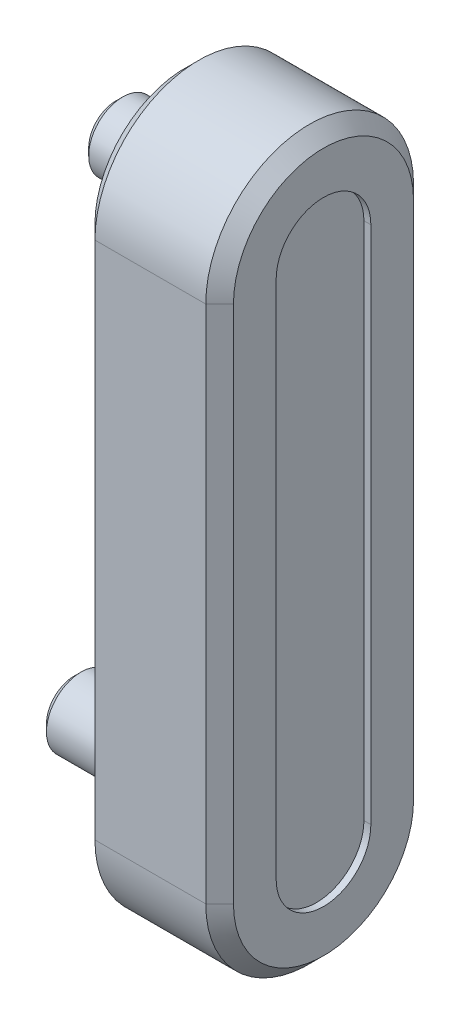
ISO-10303-21;
HEADER;
FILE_DESCRIPTION(('STEP AP214'),'2;1');
FILE_NAME('part.step','',(''),(''),'','','');
FILE_SCHEMA(('AUTOMOTIVE_DESIGN { 1 0 10303 214 1 1 1 1 }'));
ENDSEC;
DATA;
#1=APPLICATION_CONTEXT('core data for automotive mechanical design processes');
#2=APPLICATION_PROTOCOL_DEFINITION('international standard','automotive_design',2000,#1);
#3=PRODUCT_CONTEXT('',#1,'mechanical');
#4=PRODUCT('Part','Part','',(#3));
#5=PRODUCT_RELATED_PRODUCT_CATEGORY('part','',(#4));
#6=PRODUCT_DEFINITION_FORMATION('','',#4);
#7=PRODUCT_DEFINITION_CONTEXT('part definition',#1,'design');
#8=PRODUCT_DEFINITION('design','',#6,#7);
#9=PRODUCT_DEFINITION_SHAPE('','',#8);
#10=(LENGTH_UNIT() NAMED_UNIT(*) SI_UNIT(.MILLI.,.METRE.));
#11=(NAMED_UNIT(*) PLANE_ANGLE_UNIT() SI_UNIT($,.RADIAN.));
#12=(NAMED_UNIT(*) SI_UNIT($,.STERADIAN.) SOLID_ANGLE_UNIT());
#13=UNCERTAINTY_MEASURE_WITH_UNIT(LENGTH_MEASURE(1.E-05),#10,'distance_accuracy_value','');
#14=(GEOMETRIC_REPRESENTATION_CONTEXT(3) GLOBAL_UNCERTAINTY_ASSIGNED_CONTEXT((#13)) GLOBAL_UNIT_ASSIGNED_CONTEXT((#10,
#11,#12)) REPRESENTATION_CONTEXT('',''));
#15=CARTESIAN_POINT('',(0.,0.,0.));
#16=DIRECTION('',(0.,0.,1.));
#17=DIRECTION('',(1.,0.,0.));
#18=AXIS2_PLACEMENT_3D('',#15,#16,#17);
#19=CARTESIAN_POINT('',(10.,0.,0.));
#20=DIRECTION('',(-1.,0.,0.));
#21=DIRECTION('',(0.,0.,1.));
#22=AXIS2_PLACEMENT_3D('',#19,#20,#21);
#23=CYLINDRICAL_SURFACE('',#22,4.9);
#24=CARTESIAN_POINT('',(1.00000000000001,0.,0.));
#25=DIRECTION('',(1.,0.,0.));
#26=DIRECTION('',(0.,0.,-1.));
#27=AXIS2_PLACEMENT_3D('',#24,#25,#26);
#28=CIRCLE('',#27,4.9);
#29=CARTESIAN_POINT('',(1.00000000000001,0.,-4.9));
#30=VERTEX_POINT('',#29);
#31=EDGE_CURVE('E251',#30,#30,#28,.T.);
#32=ORIENTED_EDGE('',*,*,#31,.T.);
#33=EDGE_LOOP('',(#32));
#34=FACE_BOUND('',#33,.T.);
#35=CARTESIAN_POINT('',(10.,0.,0.));
#36=DIRECTION('',(1.,0.,0.));
#37=DIRECTION('',(0.,0.,-1.));
#38=AXIS2_PLACEMENT_3D('',#35,#36,#37);
#39=CIRCLE('',#38,4.9);
#40=CARTESIAN_POINT('',(10.,0.,-4.9));
#41=VERTEX_POINT('',#40);
#42=EDGE_CURVE('E187',#41,#41,#39,.T.);
#43=ORIENTED_EDGE('',*,*,#42,.F.);
#44=EDGE_LOOP('',(#43));
#45=FACE_BOUND('',#44,.T.);
#46=ADVANCED_FACE('F42',(#34,#45),#23,.T.);
#47=CARTESIAN_POINT('',(0.,0.,0.));
#48=DIRECTION('',(1.,0.,0.));
#49=DIRECTION('',(0.,0.,-1.));
#50=AXIS2_PLACEMENT_3D('',#47,#48,#49);
#51=PLANE('',#50);
#52=CARTESIAN_POINT('',(0.,0.,0.));
#53=DIRECTION('',(1.,0.,0.));
#54=DIRECTION('',(0.,0.,-1.));
#55=AXIS2_PLACEMENT_3D('',#52,#53,#54);
#56=CIRCLE('',#55,3.9);
#57=CARTESIAN_POINT('',(0.,0.,-3.9));
#58=VERTEX_POINT('',#57);
#59=EDGE_CURVE('E254',#58,#58,#56,.F.);
#60=ORIENTED_EDGE('',*,*,#59,.T.);
#61=EDGE_LOOP('',(#60));
#62=FACE_BOUND('',#61,.T.);
#63=ADVANCED_FACE('F271',(#62),#51,.F.);
#64=CARTESIAN_POINT('',(30.,0.,15.));
#65=DIRECTION('',(0.,0.,-1.));
#66=DIRECTION('',(0.,1.,0.));
#67=AXIS2_PLACEMENT_3D('',#64,#65,#66);
#68=PLANE('',#67);
#69=DIRECTION('',(-1.,0.,0.));
#70=VECTOR('',#69,1.);
#71=CARTESIAN_POINT('',(30.,0.,15.));
#72=LINE('',#71,#70);
#73=CARTESIAN_POINT('',(28.,0.,15.));
#74=VERTEX_POINT('',#73);
#75=CARTESIAN_POINT('',(12.,0.,15.));
#76=VERTEX_POINT('',#75);
#77=EDGE_CURVE('E174',#74,#76,#72,.T.);
#78=ORIENTED_EDGE('',*,*,#77,.T.);
#79=DIRECTION('',(0.,-1.,0.));
#80=VECTOR('',#79,1.);
#81=CARTESIAN_POINT('',(12.,0.,15.));
#82=LINE('',#81,#80);
#83=CARTESIAN_POINT('',(12.,-75.,15.));
#84=VERTEX_POINT('',#83);
#85=EDGE_CURVE('E215',#76,#84,#82,.T.);
#86=ORIENTED_EDGE('',*,*,#85,.T.);
#87=DIRECTION('',(-1.,0.,0.));
#88=VECTOR('',#87,1.);
#89=CARTESIAN_POINT('',(30.,-75.,15.));
#90=LINE('',#89,#88);
#91=CARTESIAN_POINT('',(28.,-75.,15.));
#92=VERTEX_POINT('',#91);
#93=EDGE_CURVE('E184',#92,#84,#90,.T.);
#94=ORIENTED_EDGE('',*,*,#93,.F.);
#95=DIRECTION('',(0.,1.,0.));
#96=VECTOR('',#95,1.);
#97=CARTESIAN_POINT('',(28.,0.,15.));
#98=LINE('',#97,#96);
#99=EDGE_CURVE('E213',#92,#74,#98,.T.);
#100=ORIENTED_EDGE('',*,*,#99,.T.);
#101=EDGE_LOOP('',(#78,#86,#94,#100));
#102=FACE_BOUND('',#101,.T.);
#103=ADVANCED_FACE('F278',(#102),#68,.F.);
#104=CARTESIAN_POINT('',(30.,-75.,0.));
#105=DIRECTION('',(-1.,0.,0.));
#106=DIRECTION('',(0.,0.,1.));
#107=AXIS2_PLACEMENT_3D('',#104,#105,#106);
#108=CYLINDRICAL_SURFACE('',#107,15.);
#109=ORIENTED_EDGE('',*,*,#93,.T.);
#110=CARTESIAN_POINT('',(12.,-75.,0.));
#111=DIRECTION('',(1.,0.,0.));
#112=DIRECTION('',(0.,0.,-1.));
#113=AXIS2_PLACEMENT_3D('',#110,#111,#112);
#114=CIRCLE('',#113,15.);
#115=CARTESIAN_POINT('',(12.,-75.,-15.));
#116=VERTEX_POINT('',#115);
#117=EDGE_CURVE('E211',#84,#116,#114,.T.);
#118=ORIENTED_EDGE('',*,*,#117,.T.);
#119=DIRECTION('',(-1.,0.,0.));
#120=VECTOR('',#119,1.);
#121=CARTESIAN_POINT('',(30.,-75.,-15.));
#122=LINE('',#121,#120);
#123=CARTESIAN_POINT('',(28.,-75.,-15.));
#124=VERTEX_POINT('',#123);
#125=EDGE_CURVE('E181',#124,#116,#122,.T.);
#126=ORIENTED_EDGE('',*,*,#125,.F.);
#127=CARTESIAN_POINT('',(28.,-75.,0.));
#128=DIRECTION('',(1.,0.,0.));
#129=DIRECTION('',(0.,0.,-1.));
#130=AXIS2_PLACEMENT_3D('',#127,#128,#129);
#131=CIRCLE('',#130,15.);
#132=EDGE_CURVE('E209',#124,#92,#131,.F.);
#133=ORIENTED_EDGE('',*,*,#132,.T.);
#134=EDGE_LOOP('',(#109,#118,#126,#133));
#135=FACE_BOUND('',#134,.T.);
#136=ADVANCED_FACE('F400',(#135),#108,.T.);
#137=CARTESIAN_POINT('',(30.,0.,-15.));
#138=DIRECTION('',(0.,0.,-1.));
#139=DIRECTION('',(0.,1.,0.));
#140=AXIS2_PLACEMENT_3D('',#137,#138,#139);
#141=PLANE('',#140);
#142=ORIENTED_EDGE('',*,*,#125,.T.);
#143=DIRECTION('',(0.,1.,0.));
#144=VECTOR('',#143,1.);
#145=CARTESIAN_POINT('',(12.,0.,-15.));
#146=LINE('',#145,#144);
#147=CARTESIAN_POINT('',(12.,0.,-15.));
#148=VERTEX_POINT('',#147);
#149=EDGE_CURVE('E202',#116,#148,#146,.T.);
#150=ORIENTED_EDGE('',*,*,#149,.T.);
#151=DIRECTION('',(-1.,0.,0.));
#152=VECTOR('',#151,1.);
#153=CARTESIAN_POINT('',(30.,0.,-15.));
#154=LINE('',#153,#152);
#155=CARTESIAN_POINT('',(28.,0.,-15.));
#156=VERTEX_POINT('',#155);
#157=EDGE_CURVE('E177',#156,#148,#154,.T.);
#158=ORIENTED_EDGE('',*,*,#157,.F.);
#159=DIRECTION('',(0.,-1.,0.));
#160=VECTOR('',#159,1.);
#161=CARTESIAN_POINT('',(28.,0.,-15.));
#162=LINE('',#161,#160);
#163=EDGE_CURVE('E199',#156,#124,#162,.T.);
#164=ORIENTED_EDGE('',*,*,#163,.T.);
#165=EDGE_LOOP('',(#142,#150,#158,#164));
#166=FACE_BOUND('',#165,.T.);
#167=ADVANCED_FACE('F396',(#166),#141,.T.);
#168=CARTESIAN_POINT('',(30.,0.,0.));
#169=DIRECTION('',(-1.,0.,0.));
#170=DIRECTION('',(0.,0.,1.));
#171=AXIS2_PLACEMENT_3D('',#168,#169,#170);
#172=CYLINDRICAL_SURFACE('',#171,15.);
#173=ORIENTED_EDGE('',*,*,#157,.T.);
#174=CARTESIAN_POINT('',(12.,0.,0.));
#175=DIRECTION('',(1.,0.,0.));
#176=DIRECTION('',(0.,0.,-1.));
#177=AXIS2_PLACEMENT_3D('',#174,#175,#176);
#178=CIRCLE('',#177,15.);
#179=EDGE_CURVE('E207',#148,#76,#178,.T.);
#180=ORIENTED_EDGE('',*,*,#179,.T.);
#181=ORIENTED_EDGE('',*,*,#77,.F.);
#182=CARTESIAN_POINT('',(28.,0.,0.));
#183=DIRECTION('',(1.,0.,0.));
#184=DIRECTION('',(0.,0.,-1.));
#185=AXIS2_PLACEMENT_3D('',#182,#183,#184);
#186=CIRCLE('',#185,15.);
#187=EDGE_CURVE('E205',#74,#156,#186,.F.);
#188=ORIENTED_EDGE('',*,*,#187,.T.);
#189=EDGE_LOOP('',(#173,#180,#181,#188));
#190=FACE_BOUND('',#189,.T.);
#191=ADVANCED_FACE('F389',(#190),#172,.T.);
#192=CARTESIAN_POINT('',(30.,0.,0.));
#193=DIRECTION('',(1.,0.,0.));
#194=DIRECTION('',(0.,0.,-1.));
#195=AXIS2_PLACEMENT_3D('',#192,#193,#194);
#196=PLANE('',#195);
#197=CARTESIAN_POINT('',(30.,0.,0.));
#198=DIRECTION('',(1.,0.,0.));
#199=DIRECTION('',(0.,0.,-1.));
#200=AXIS2_PLACEMENT_3D('',#197,#198,#199);
#201=CIRCLE('',#200,6.83563427501715);
#202=CARTESIAN_POINT('',(30.,0.,-6.83563427501715));
#203=VERTEX_POINT('',#202);
#204=CARTESIAN_POINT('',(30.,0.,6.83563427501715));
#205=VERTEX_POINT('',#204);
#206=EDGE_CURVE('E58',#203,#205,#201,.T.);
#207=ORIENTED_EDGE('',*,*,#206,.F.);
#208=DIRECTION('',(0.,1.,0.));
#209=VECTOR('',#208,1.);
#210=CARTESIAN_POINT('',(30.,0.,-6.83563427501715));
#211=LINE('',#210,#209);
#212=CARTESIAN_POINT('',(30.,-75.,-6.83563427501715));
#213=VERTEX_POINT('',#212);
#214=EDGE_CURVE('E154',#213,#203,#211,.T.);
#215=ORIENTED_EDGE('',*,*,#214,.F.);
#216=CARTESIAN_POINT('',(30.,-75.,0.));
#217=DIRECTION('',(1.,0.,0.));
#218=DIRECTION('',(0.,0.,-1.));
#219=AXIS2_PLACEMENT_3D('',#216,#217,#218);
#220=CIRCLE('',#219,6.83563427501715);
#221=CARTESIAN_POINT('',(30.,-75.,6.83563427501714));
#222=VERTEX_POINT('',#221);
#223=EDGE_CURVE('E157',#222,#213,#220,.T.);
#224=ORIENTED_EDGE('',*,*,#223,.F.);
#225=DIRECTION('',(0.,-1.,0.));
#226=VECTOR('',#225,1.);
#227=CARTESIAN_POINT('',(30.,0.,6.83563427501715));
#228=LINE('',#227,#226);
#229=EDGE_CURVE('E163',#205,#222,#228,.T.);
#230=ORIENTED_EDGE('',*,*,#229,.F.);
#231=EDGE_LOOP('',(#207,#215,#224,#230));
#232=FACE_BOUND('',#231,.T.);
#233=CARTESIAN_POINT('',(30.,-75.,0.));
#234=DIRECTION('',(1.,0.,0.));
#235=DIRECTION('',(0.,0.,-1.));
#236=AXIS2_PLACEMENT_3D('',#233,#234,#235);
#237=CIRCLE('',#236,13.);
#238=CARTESIAN_POINT('',(30.,-75.,13.));
#239=VERTEX_POINT('',#238);
#240=CARTESIAN_POINT('',(30.,-75.,-13.));
#241=VERTEX_POINT('',#240);
#242=EDGE_CURVE('E219',#239,#241,#237,.T.);
#243=ORIENTED_EDGE('',*,*,#242,.T.);
#244=DIRECTION('',(0.,1.,0.));
#245=VECTOR('',#244,1.);
#246=CARTESIAN_POINT('',(30.,0.,-13.));
#247=LINE('',#246,#245);
#248=CARTESIAN_POINT('',(30.,0.,-13.));
#249=VERTEX_POINT('',#248);
#250=EDGE_CURVE('E223',#241,#249,#247,.T.);
#251=ORIENTED_EDGE('',*,*,#250,.T.);
#252=CARTESIAN_POINT('',(30.,0.,0.));
#253=DIRECTION('',(1.,0.,0.));
#254=DIRECTION('',(0.,0.,-1.));
#255=AXIS2_PLACEMENT_3D('',#252,#253,#254);
#256=CIRCLE('',#255,13.);
#257=CARTESIAN_POINT('',(30.,0.,13.));
#258=VERTEX_POINT('',#257);
#259=EDGE_CURVE('E221',#249,#258,#256,.T.);
#260=ORIENTED_EDGE('',*,*,#259,.T.);
#261=DIRECTION('',(0.,-1.,0.));
#262=VECTOR('',#261,1.);
#263=CARTESIAN_POINT('',(30.,-75.,13.));
#264=LINE('',#263,#262);
#265=EDGE_CURVE('E217',#258,#239,#264,.T.);
#266=ORIENTED_EDGE('',*,*,#265,.T.);
#267=EDGE_LOOP('',(#243,#251,#260,#266));
#268=FACE_BOUND('',#267,.T.);
#269=ADVANCED_FACE('F386',(#232,#268),#196,.T.);
#270=CARTESIAN_POINT('',(10.,0.,0.));
#271=DIRECTION('',(1.,0.,0.));
#272=DIRECTION('',(0.,0.,-1.));
#273=AXIS2_PLACEMENT_3D('',#270,#271,#272);
#274=PLANE('',#273);
#275=CARTESIAN_POINT('',(10.,-75.,0.));
#276=DIRECTION('',(1.,0.,0.));
#277=DIRECTION('',(0.,0.,-1.));
#278=AXIS2_PLACEMENT_3D('',#275,#276,#277);
#279=CIRCLE('',#278,10.);
#280=CARTESIAN_POINT('',(10.,-75.,-10.));
#281=VERTEX_POINT('',#280);
#282=EDGE_CURVE('E226',#281,#281,#279,.F.);
#283=ORIENTED_EDGE('',*,*,#282,.F.);
#284=EDGE_LOOP('',(#283));
#285=FACE_BOUND('',#284,.T.);
#286=CARTESIAN_POINT('',(10.,0.,0.));
#287=DIRECTION('',(1.,0.,0.));
#288=DIRECTION('',(0.,0.,-1.));
#289=AXIS2_PLACEMENT_3D('',#286,#287,#288);
#290=CIRCLE('',#289,13.);
#291=CARTESIAN_POINT('',(10.,0.,13.));
#292=VERTEX_POINT('',#291);
#293=CARTESIAN_POINT('',(10.,0.,-13.));
#294=VERTEX_POINT('',#293);
#295=EDGE_CURVE('E194',#292,#294,#290,.F.);
#296=ORIENTED_EDGE('',*,*,#295,.T.);
#297=DIRECTION('',(0.,-1.,0.));
#298=VECTOR('',#297,1.);
#299=CARTESIAN_POINT('',(10.,-75.,-13.));
#300=LINE('',#299,#298);
#301=CARTESIAN_POINT('',(10.,-75.,-13.));
#302=VERTEX_POINT('',#301);
#303=EDGE_CURVE('E196',#294,#302,#300,.T.);
#304=ORIENTED_EDGE('',*,*,#303,.T.);
#305=CARTESIAN_POINT('',(10.,-75.,0.));
#306=DIRECTION('',(1.,0.,0.));
#307=DIRECTION('',(0.,0.,-1.));
#308=AXIS2_PLACEMENT_3D('',#305,#306,#307);
#309=CIRCLE('',#308,13.);
#310=CARTESIAN_POINT('',(10.,-75.,13.));
#311=VERTEX_POINT('',#310);
#312=EDGE_CURVE('E192',#302,#311,#309,.F.);
#313=ORIENTED_EDGE('',*,*,#312,.T.);
#314=DIRECTION('',(0.,1.,0.));
#315=VECTOR('',#314,1.);
#316=CARTESIAN_POINT('',(10.,0.,13.));
#317=LINE('',#316,#315);
#318=EDGE_CURVE('E190',#311,#292,#317,.T.);
#319=ORIENTED_EDGE('',*,*,#318,.T.);
#320=EDGE_LOOP('',(#296,#304,#313,#319));
#321=FACE_BOUND('',#320,.T.);
#322=ORIENTED_EDGE('',*,*,#42,.T.);
#323=EDGE_LOOP('',(#322));
#324=FACE_BOUND('',#323,.T.);
#325=ADVANCED_FACE('F313',(#285,#321,#324),#274,.F.);
#326=CARTESIAN_POINT('',(12.,0.,15.));
#327=DIRECTION('',(0.70710678118655,0.,-0.707106781186545));
#328=DIRECTION('',(0.,-1.,0.));
#329=AXIS2_PLACEMENT_3D('',#326,#327,#328);
#330=PLANE('',#329);
#331=DIRECTION('',(-0.707106781186545,0.,-0.70710678118655));
#332=VECTOR('',#331,1.);
#333=CARTESIAN_POINT('',(12.,-75.,15.));
#334=LINE('',#333,#332);
#335=EDGE_CURVE('E232',#84,#311,#334,.T.);
#336=ORIENTED_EDGE('',*,*,#335,.F.);
#337=ORIENTED_EDGE('',*,*,#85,.F.);
#338=DIRECTION('',(0.707106781186545,0.,0.70710678118655));
#339=VECTOR('',#338,1.);
#340=CARTESIAN_POINT('',(10.,0.,13.));
#341=LINE('',#340,#339);
#342=EDGE_CURVE('E178',#292,#76,#341,.T.);
#343=ORIENTED_EDGE('',*,*,#342,.F.);
#344=ORIENTED_EDGE('',*,*,#318,.F.);
#345=EDGE_LOOP('',(#336,#337,#343,#344));
#346=FACE_BOUND('',#345,.T.);
#347=ADVANCED_FACE('F307',(#346),#330,.F.);
#348=CARTESIAN_POINT('',(12.,0.,0.));
#349=DIRECTION('',(1.,0.,0.));
#350=DIRECTION('',(0.,0.,-1.));
#351=AXIS2_PLACEMENT_3D('',#348,#349,#350);
#352=CONICAL_SURFACE('',#351,15.,0.785398163397452);
#353=ORIENTED_EDGE('',*,*,#342,.T.);
#354=ORIENTED_EDGE('',*,*,#179,.F.);
#355=DIRECTION('',(0.707106781186545,0.,-0.70710678118655));
#356=VECTOR('',#355,1.);
#357=CARTESIAN_POINT('',(10.,0.,-13.));
#358=LINE('',#357,#356);
#359=EDGE_CURVE('E229',#294,#148,#358,.T.);
#360=ORIENTED_EDGE('',*,*,#359,.F.);
#361=ORIENTED_EDGE('',*,*,#295,.F.);
#362=EDGE_LOOP('',(#353,#354,#360,#361));
#363=FACE_BOUND('',#362,.T.);
#364=ADVANCED_FACE('F300',(#363),#352,.T.);
#365=CARTESIAN_POINT('',(12.,-75.,0.));
#366=DIRECTION('',(1.,0.,0.));
#367=DIRECTION('',(0.,0.,-1.));
#368=AXIS2_PLACEMENT_3D('',#365,#366,#367);
#369=CONICAL_SURFACE('',#368,15.,0.785398163397452);
#370=ORIENTED_EDGE('',*,*,#335,.T.);
#371=ORIENTED_EDGE('',*,*,#312,.F.);
#372=DIRECTION('',(-0.707106781186545,0.,0.70710678118655));
#373=VECTOR('',#372,1.);
#374=CARTESIAN_POINT('',(12.,-75.,-15.));
#375=LINE('',#374,#373);
#376=EDGE_CURVE('E227',#116,#302,#375,.T.);
#377=ORIENTED_EDGE('',*,*,#376,.F.);
#378=ORIENTED_EDGE('',*,*,#117,.F.);
#379=EDGE_LOOP('',(#370,#371,#377,#378));
#380=FACE_BOUND('',#379,.T.);
#381=ADVANCED_FACE('F293',(#380),#369,.T.);
#382=CARTESIAN_POINT('',(10.,0.,-13.));
#383=DIRECTION('',(-0.70710678118655,0.,-0.707106781186545));
#384=DIRECTION('',(0.,1.,0.));
#385=AXIS2_PLACEMENT_3D('',#382,#383,#384);
#386=PLANE('',#385);
#387=ORIENTED_EDGE('',*,*,#359,.T.);
#388=ORIENTED_EDGE('',*,*,#149,.F.);
#389=ORIENTED_EDGE('',*,*,#376,.T.);
#390=ORIENTED_EDGE('',*,*,#303,.F.);
#391=EDGE_LOOP('',(#387,#388,#389,#390));
#392=FACE_BOUND('',#391,.T.);
#393=ADVANCED_FACE('F285',(#392),#386,.T.);
#394=CARTESIAN_POINT('',(30.,0.,13.));
#395=DIRECTION('',(0.707106781186545,0.,0.70710678118655));
#396=DIRECTION('',(0.,1.,0.));
#397=AXIS2_PLACEMENT_3D('',#394,#395,#396);
#398=PLANE('',#397);
#399=DIRECTION('',(-0.70710678118655,0.,0.707106781186545));
#400=VECTOR('',#399,1.);
#401=CARTESIAN_POINT('',(30.,-75.,13.));
#402=LINE('',#401,#400);
#403=EDGE_CURVE('E239',#239,#92,#402,.T.);
#404=ORIENTED_EDGE('',*,*,#403,.F.);
#405=ORIENTED_EDGE('',*,*,#265,.F.);
#406=DIRECTION('',(0.70710678118655,0.,-0.707106781186545));
#407=VECTOR('',#406,1.);
#408=CARTESIAN_POINT('',(28.,0.,15.));
#409=LINE('',#408,#407);
#410=EDGE_CURVE('E230',#74,#258,#409,.T.);
#411=ORIENTED_EDGE('',*,*,#410,.F.);
#412=ORIENTED_EDGE('',*,*,#99,.F.);
#413=EDGE_LOOP('',(#404,#405,#411,#412));
#414=FACE_BOUND('',#413,.T.);
#415=ADVANCED_FACE('F292',(#414),#398,.T.);
#416=CARTESIAN_POINT('',(30.,0.,0.));
#417=DIRECTION('',(-1.,0.,0.));
#418=DIRECTION('',(0.,0.,1.));
#419=AXIS2_PLACEMENT_3D('',#416,#417,#418);
#420=CONICAL_SURFACE('',#419,13.,0.785398163397445);
#421=ORIENTED_EDGE('',*,*,#410,.T.);
#422=ORIENTED_EDGE('',*,*,#259,.F.);
#423=DIRECTION('',(0.70710678118655,0.,0.707106781186545));
#424=VECTOR('',#423,1.);
#425=CARTESIAN_POINT('',(28.,0.,-15.));
#426=LINE('',#425,#424);
#427=EDGE_CURVE('E66',#156,#249,#426,.T.);
#428=ORIENTED_EDGE('',*,*,#427,.F.);
#429=ORIENTED_EDGE('',*,*,#187,.F.);
#430=EDGE_LOOP('',(#421,#422,#428,#429));
#431=FACE_BOUND('',#430,.T.);
#432=ADVANCED_FACE('F329',(#431),#420,.T.);
#433=CARTESIAN_POINT('',(30.,-75.,0.));
#434=DIRECTION('',(-1.,0.,0.));
#435=DIRECTION('',(0.,0.,1.));
#436=AXIS2_PLACEMENT_3D('',#433,#434,#435);
#437=CONICAL_SURFACE('',#436,13.,0.785398163397445);
#438=ORIENTED_EDGE('',*,*,#403,.T.);
#439=ORIENTED_EDGE('',*,*,#132,.F.);
#440=DIRECTION('',(-0.70710678118655,0.,-0.707106781186545));
#441=VECTOR('',#440,1.);
#442=CARTESIAN_POINT('',(30.,-75.,-13.));
#443=LINE('',#442,#441);
#444=EDGE_CURVE('E170',#241,#124,#443,.T.);
#445=ORIENTED_EDGE('',*,*,#444,.F.);
#446=ORIENTED_EDGE('',*,*,#242,.F.);
#447=EDGE_LOOP('',(#438,#439,#445,#446));
#448=FACE_BOUND('',#447,.T.);
#449=ADVANCED_FACE('F323',(#448),#437,.T.);
#450=CARTESIAN_POINT('',(28.,0.,-15.));
#451=DIRECTION('',(-0.707106781186545,0.,0.70710678118655));
#452=DIRECTION('',(0.,-1.,0.));
#453=AXIS2_PLACEMENT_3D('',#450,#451,#452);
#454=PLANE('',#453);
#455=ORIENTED_EDGE('',*,*,#427,.T.);
#456=ORIENTED_EDGE('',*,*,#250,.F.);
#457=ORIENTED_EDGE('',*,*,#444,.T.);
#458=ORIENTED_EDGE('',*,*,#163,.F.);
#459=EDGE_LOOP('',(#455,#456,#457,#458));
#460=FACE_BOUND('',#459,.T.);
#461=ADVANCED_FACE('F316',(#460),#454,.F.);
#462=CARTESIAN_POINT('',(29.,0.,0.));
#463=DIRECTION('',(1.,0.,0.));
#464=DIRECTION('',(0.,0.,-1.));
#465=AXIS2_PLACEMENT_3D('',#462,#463,#464);
#466=CYLINDRICAL_SURFACE('',#465,6.83563427501715);
#467=ORIENTED_EDGE('',*,*,#206,.T.);
#468=DIRECTION('',(1.,0.,0.));
#469=VECTOR('',#468,1.);
#470=CARTESIAN_POINT('',(29.,0.,6.83563427501715));
#471=LINE('',#470,#469);
#472=CARTESIAN_POINT('',(29.,0.,6.83563427501715));
#473=VERTEX_POINT('',#472);
#474=EDGE_CURVE('E132',#473,#205,#471,.T.);
#475=ORIENTED_EDGE('',*,*,#474,.F.);
#476=CARTESIAN_POINT('',(29.,0.,0.));
#477=DIRECTION('',(1.,0.,0.));
#478=DIRECTION('',(0.,0.,-1.));
#479=AXIS2_PLACEMENT_3D('',#476,#477,#478);
#480=CIRCLE('',#479,6.83563427501715);
#481=CARTESIAN_POINT('',(29.,0.,-6.83563427501715));
#482=VERTEX_POINT('',#481);
#483=EDGE_CURVE('E136',#482,#473,#480,.T.);
#484=ORIENTED_EDGE('',*,*,#483,.F.);
#485=DIRECTION('',(1.,0.,0.));
#486=VECTOR('',#485,1.);
#487=CARTESIAN_POINT('',(29.,0.,-6.83563427501715));
#488=LINE('',#487,#486);
#489=EDGE_CURVE('E168',#482,#203,#488,.T.);
#490=ORIENTED_EDGE('',*,*,#489,.T.);
#491=EDGE_LOOP('',(#467,#475,#484,#490));
#492=FACE_BOUND('',#491,.T.);
#493=ADVANCED_FACE('F134',(#492),#466,.F.);
#494=CARTESIAN_POINT('',(29.,0.,-6.83563427501715));
#495=DIRECTION('',(0.,0.,-1.));
#496=DIRECTION('',(0.,1.,0.));
#497=AXIS2_PLACEMENT_3D('',#494,#495,#496);
#498=PLANE('',#497);
#499=ORIENTED_EDGE('',*,*,#214,.T.);
#500=ORIENTED_EDGE('',*,*,#489,.F.);
#501=DIRECTION('',(0.,1.,0.));
#502=VECTOR('',#501,1.);
#503=CARTESIAN_POINT('',(29.,0.,-6.83563427501715));
#504=LINE('',#503,#502);
#505=CARTESIAN_POINT('',(29.,-75.,-6.83563427501715));
#506=VERTEX_POINT('',#505);
#507=EDGE_CURVE('E142',#506,#482,#504,.T.);
#508=ORIENTED_EDGE('',*,*,#507,.F.);
#509=DIRECTION('',(1.,0.,0.));
#510=VECTOR('',#509,1.);
#511=CARTESIAN_POINT('',(29.,-75.,-6.83563427501715));
#512=LINE('',#511,#510);
#513=EDGE_CURVE('E171',#506,#213,#512,.T.);
#514=ORIENTED_EDGE('',*,*,#513,.T.);
#515=EDGE_LOOP('',(#499,#500,#508,#514));
#516=FACE_BOUND('',#515,.T.);
#517=ADVANCED_FACE('F374',(#516),#498,.F.);
#518=CARTESIAN_POINT('',(29.,-75.,0.));
#519=DIRECTION('',(1.,0.,0.));
#520=DIRECTION('',(0.,0.,-1.));
#521=AXIS2_PLACEMENT_3D('',#518,#519,#520);
#522=CYLINDRICAL_SURFACE('',#521,6.83563427501715);
#523=ORIENTED_EDGE('',*,*,#223,.T.);
#524=ORIENTED_EDGE('',*,*,#513,.F.);
#525=CARTESIAN_POINT('',(29.,-75.,0.));
#526=DIRECTION('',(1.,0.,0.));
#527=DIRECTION('',(0.,0.,-1.));
#528=AXIS2_PLACEMENT_3D('',#525,#526,#527);
#529=CIRCLE('',#528,6.83563427501715);
#530=CARTESIAN_POINT('',(29.,-75.,6.83563427501714));
#531=VERTEX_POINT('',#530);
#532=EDGE_CURVE('E150',#531,#506,#529,.T.);
#533=ORIENTED_EDGE('',*,*,#532,.F.);
#534=DIRECTION('',(1.,0.,0.));
#535=VECTOR('',#534,1.);
#536=CARTESIAN_POINT('',(29.,-75.,6.83563427501714));
#537=LINE('',#536,#535);
#538=EDGE_CURVE('E141',#531,#222,#537,.T.);
#539=ORIENTED_EDGE('',*,*,#538,.T.);
#540=EDGE_LOOP('',(#523,#524,#533,#539));
#541=FACE_BOUND('',#540,.T.);
#542=ADVANCED_FACE('F377',(#541),#522,.F.);
#543=CARTESIAN_POINT('',(29.,0.,6.83563427501715));
#544=DIRECTION('',(0.,0.,1.));
#545=DIRECTION('',(0.,-1.,0.));
#546=AXIS2_PLACEMENT_3D('',#543,#544,#545);
#547=PLANE('',#546);
#548=ORIENTED_EDGE('',*,*,#229,.T.);
#549=ORIENTED_EDGE('',*,*,#538,.F.);
#550=DIRECTION('',(0.,-1.,0.));
#551=VECTOR('',#550,1.);
#552=CARTESIAN_POINT('',(29.,0.,6.83563427501715));
#553=LINE('',#552,#551);
#554=EDGE_CURVE('E145',#473,#531,#553,.T.);
#555=ORIENTED_EDGE('',*,*,#554,.F.);
#556=ORIENTED_EDGE('',*,*,#474,.T.);
#557=EDGE_LOOP('',(#548,#549,#555,#556));
#558=FACE_BOUND('',#557,.T.);
#559=ADVANCED_FACE('F146',(#558),#547,.F.);
#560=CARTESIAN_POINT('',(29.,0.,0.));
#561=DIRECTION('',(1.,0.,0.));
#562=DIRECTION('',(0.,0.,-1.));
#563=AXIS2_PLACEMENT_3D('',#560,#561,#562);
#564=PLANE('',#563);
#565=ORIENTED_EDGE('',*,*,#483,.T.);
#566=ORIENTED_EDGE('',*,*,#554,.T.);
#567=ORIENTED_EDGE('',*,*,#532,.T.);
#568=ORIENTED_EDGE('',*,*,#507,.T.);
#569=EDGE_LOOP('',(#565,#566,#567,#568));
#570=FACE_BOUND('',#569,.T.);
#571=ADVANCED_FACE('F152',(#570),#564,.T.);
#572=CARTESIAN_POINT('',(9.,-75.,0.));
#573=DIRECTION('',(-1.,0.,0.));
#574=DIRECTION('',(0.,0.,1.));
#575=AXIS2_PLACEMENT_3D('',#572,#573,#574);
#576=PLANE('',#575);
#577=CARTESIAN_POINT('',(9.,-75.,0.));
#578=DIRECTION('',(-1.,0.,0.));
#579=DIRECTION('',(0.,0.,1.));
#580=AXIS2_PLACEMENT_3D('',#577,#578,#579);
#581=CIRCLE('',#580,9.00000000000001);
#582=CARTESIAN_POINT('',(9.,-75.,9.));
#583=VERTEX_POINT('',#582);
#584=EDGE_CURVE('E248',#583,#583,#581,.T.);
#585=ORIENTED_EDGE('',*,*,#584,.T.);
#586=EDGE_LOOP('',(#585));
#587=FACE_BOUND('',#586,.T.);
#588=CARTESIAN_POINT('',(9.,-75.,0.));
#589=DIRECTION('',(-1.,0.,0.));
#590=DIRECTION('',(0.,0.,1.));
#591=AXIS2_PLACEMENT_3D('',#588,#589,#590);
#592=CIRCLE('',#591,5.00000000000001);
#593=CARTESIAN_POINT('',(9.,-75.,5.));
#594=VERTEX_POINT('',#593);
#595=EDGE_CURVE('E164',#594,#594,#592,.T.);
#596=ORIENTED_EDGE('',*,*,#595,.F.);
#597=EDGE_LOOP('',(#596));
#598=FACE_BOUND('',#597,.T.);
#599=ADVANCED_FACE('F360',(#587,#598),#576,.T.);
#600=CARTESIAN_POINT('',(-6.,-75.,0.));
#601=DIRECTION('',(-1.,0.,0.));
#602=DIRECTION('',(0.,0.,1.));
#603=AXIS2_PLACEMENT_3D('',#600,#601,#602);
#604=PLANE('',#603);
#605=CARTESIAN_POINT('',(-6.,-75.,0.));
#606=DIRECTION('',(-1.,0.,0.));
#607=DIRECTION('',(0.,0.,1.));
#608=AXIS2_PLACEMENT_3D('',#605,#606,#607);
#609=CIRCLE('',#608,4.);
#610=CARTESIAN_POINT('',(-6.,-75.,3.99999999999999));
#611=VERTEX_POINT('',#610);
#612=EDGE_CURVE('E51',#611,#611,#609,.T.);
#613=ORIENTED_EDGE('',*,*,#612,.T.);
#614=EDGE_LOOP('',(#613));
#615=FACE_BOUND('',#614,.T.);
#616=ADVANCED_FACE('F259',(#615),#604,.T.);
#617=CARTESIAN_POINT('',(-6.,-75.,0.));
#618=DIRECTION('',(1.,0.,0.));
#619=DIRECTION('',(0.,0.,-1.));
#620=AXIS2_PLACEMENT_3D('',#617,#618,#619);
#621=CYLINDRICAL_SURFACE('',#620,5.00000000000001);
#622=CARTESIAN_POINT('',(-4.99999999999998,-75.,0.));
#623=DIRECTION('',(-1.,0.,0.));
#624=DIRECTION('',(0.,0.,1.));
#625=AXIS2_PLACEMENT_3D('',#622,#623,#624);
#626=CIRCLE('',#625,5.00000000000001);
#627=CARTESIAN_POINT('',(-4.99999999999998,-75.,5.));
#628=VERTEX_POINT('',#627);
#629=EDGE_CURVE('E11',#628,#628,#626,.F.);
#630=ORIENTED_EDGE('',*,*,#629,.T.);
#631=EDGE_LOOP('',(#630));
#632=FACE_BOUND('',#631,.T.);
#633=ORIENTED_EDGE('',*,*,#595,.T.);
#634=EDGE_LOOP('',(#633));
#635=FACE_BOUND('',#634,.T.);
#636=ADVANCED_FACE('F345',(#632,#635),#621,.T.);
#637=CARTESIAN_POINT('',(9.,-75.,0.));
#638=DIRECTION('',(1.,0.,0.));
#639=DIRECTION('',(0.,0.,-1.));
#640=AXIS2_PLACEMENT_3D('',#637,#638,#639);
#641=CONICAL_SURFACE('',#640,9.00000000000001,0.785398163397445);
#642=ORIENTED_EDGE('',*,*,#282,.T.);
#643=EDGE_LOOP('',(#642));
#644=FACE_BOUND('',#643,.T.);
#645=ORIENTED_EDGE('',*,*,#584,.F.);
#646=EDGE_LOOP('',(#645));
#647=FACE_BOUND('',#646,.T.);
#648=ADVANCED_FACE('F267',(#644,#647),#641,.T.);
#649=CARTESIAN_POINT('',(1.00000000000001,0.,0.));
#650=DIRECTION('',(1.,0.,0.));
#651=DIRECTION('',(0.,0.,-1.));
#652=AXIS2_PLACEMENT_3D('',#649,#650,#651);
#653=CONICAL_SURFACE('',#652,4.9,0.785398163397443);
#654=ORIENTED_EDGE('',*,*,#59,.F.);
#655=EDGE_LOOP('',(#654));
#656=FACE_BOUND('',#655,.T.);
#657=ORIENTED_EDGE('',*,*,#31,.F.);
#658=EDGE_LOOP('',(#657));
#659=FACE_BOUND('',#658,.T.);
#660=ADVANCED_FACE('F262',(#656,#659),#653,.T.);
#661=CARTESIAN_POINT('',(-6.,-75.,0.));
#662=DIRECTION('',(1.,0.,0.));
#663=DIRECTION('',(0.,0.,-1.));
#664=AXIS2_PLACEMENT_3D('',#661,#662,#663);
#665=CONICAL_SURFACE('',#664,4.,0.78539816339744);
#666=ORIENTED_EDGE('',*,*,#629,.F.);
#667=EDGE_LOOP('',(#666));
#668=FACE_BOUND('',#667,.T.);
#669=ORIENTED_EDGE('',*,*,#612,.F.);
#670=EDGE_LOOP('',(#669));
#671=FACE_BOUND('',#670,.T.);
#672=ADVANCED_FACE('F45',(#668,#671),#665,.T.);
#673=CLOSED_SHELL('',(#46,#63,#103,#136,#167,#191,#269,#325,#347,#364,#381,#393,#415,#432,#449,
#461,#493,#517,#542,#559,#571,#599,#616,#636,#648,#660,#672));
#674=MANIFOLD_SOLID_BREP('B2',#673);
#675=ADVANCED_BREP_SHAPE_REPRESENTATION('',(#18,#674),#14);
#676=SHAPE_DEFINITION_REPRESENTATION(#9,#675);
ENDSEC;
END-ISO-10303-21;
